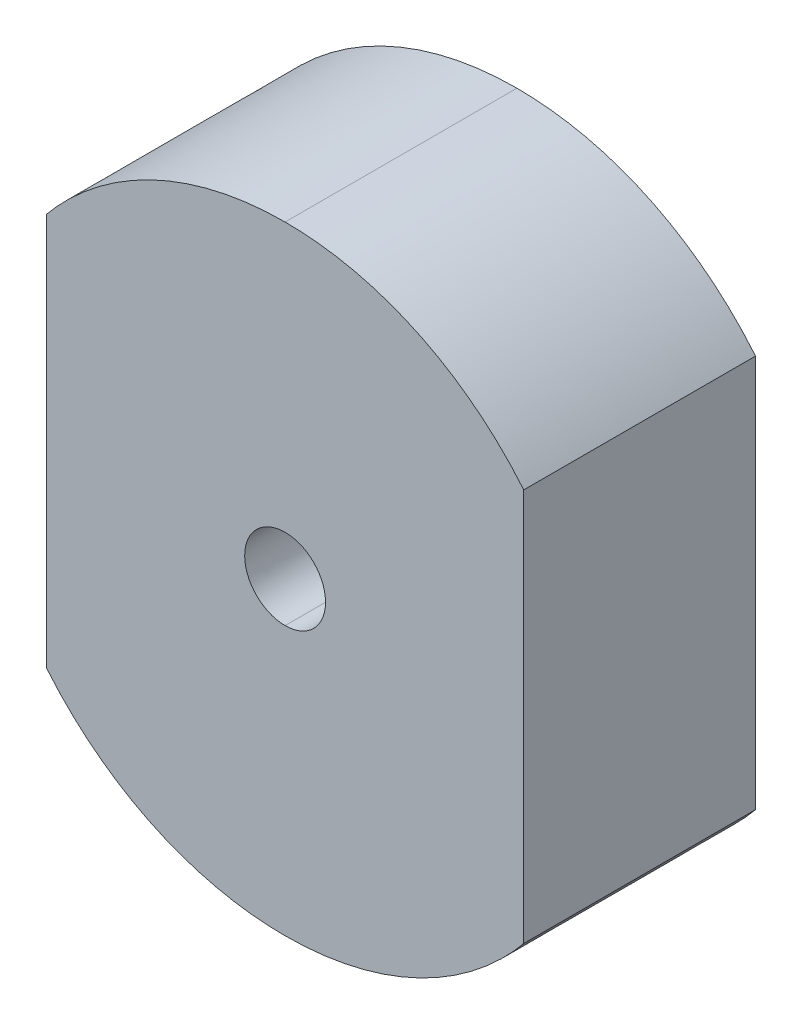
ISO-10303-21;
HEADER;
FILE_DESCRIPTION(('STEP AP214'),'2;1');
FILE_NAME('part.step','',(''),(''),'','','');
FILE_SCHEMA(('AUTOMOTIVE_DESIGN { 1 0 10303 214 1 1 1 1 }'));
ENDSEC;
DATA;
#1=APPLICATION_CONTEXT('core data for automotive mechanical design processes');
#2=APPLICATION_PROTOCOL_DEFINITION('international standard','automotive_design',2000,#1);
#3=PRODUCT_CONTEXT('',#1,'mechanical');
#4=PRODUCT('Part','Part','',(#3));
#5=PRODUCT_RELATED_PRODUCT_CATEGORY('part','',(#4));
#6=PRODUCT_DEFINITION_FORMATION('','',#4);
#7=PRODUCT_DEFINITION_CONTEXT('part definition',#1,'design');
#8=PRODUCT_DEFINITION('design','',#6,#7);
#9=PRODUCT_DEFINITION_SHAPE('','',#8);
#10=(LENGTH_UNIT() NAMED_UNIT(*) SI_UNIT(.MILLI.,.METRE.));
#11=(NAMED_UNIT(*) PLANE_ANGLE_UNIT() SI_UNIT($,.RADIAN.));
#12=(NAMED_UNIT(*) SI_UNIT($,.STERADIAN.) SOLID_ANGLE_UNIT());
#13=UNCERTAINTY_MEASURE_WITH_UNIT(LENGTH_MEASURE(1.E-05),#10,'distance_accuracy_value','');
#14=(GEOMETRIC_REPRESENTATION_CONTEXT(3) GLOBAL_UNCERTAINTY_ASSIGNED_CONTEXT((#13)) GLOBAL_UNIT_ASSIGNED_CONTEXT((#10,
#11,#12)) REPRESENTATION_CONTEXT('',''));
#15=CARTESIAN_POINT('',(0.,0.,0.));
#16=DIRECTION('',(0.,0.,1.));
#17=DIRECTION('',(1.,0.,0.));
#18=AXIS2_PLACEMENT_3D('',#15,#16,#17);
#19=CARTESIAN_POINT('',(145.612196025778,-82.1540062715015,3.175));
#20=DIRECTION('',(0.,0.,-1.));
#21=DIRECTION('',(-1.,0.,0.));
#22=AXIS2_PLACEMENT_3D('',#19,#20,#21);
#23=PLANE('',#22);
#24=CARTESIAN_POINT('',(147.044031539421,-83.2788810858527,3.175));
#25=CARTESIAN_POINT('',(146.267593144241,-82.3366259385551,3.175));
#26=CARTESIAN_POINT('',(145.091782054831,-81.7358228176235,3.175));
#27=CARTESIAN_POINT('',(143.775411069588,-81.7358228176235,3.175));
#28=B_SPLINE_CURVE_WITH_KNOTS('',3,(#24,#25,#26,#27),.UNSPECIFIED.,.F.,.F.,(4,4),(0.,1.),.UNSPECIFIED.);
#29=CARTESIAN_POINT('',(147.044031539421,-83.2788810858527,3.175));
#30=VERTEX_POINT('',#29);
#31=CARTESIAN_POINT('',(143.775411069588,-81.7358228176235,3.175));
#32=VERTEX_POINT('',#31);
#33=EDGE_CURVE('E193',#30,#32,#28,.T.);
#34=ORIENTED_EDGE('',*,*,#33,.T.);
#35=CARTESIAN_POINT('',(143.775411069588,-81.7358228176235,3.175));
#36=CARTESIAN_POINT('',(142.45912621173,-81.7358228176235,3.175));
#37=CARTESIAN_POINT('',(141.283228994935,-82.3366690022481,3.175));
#38=CARTESIAN_POINT('',(140.506790599751,-83.2789456813937,3.175));
#39=B_SPLINE_CURVE_WITH_KNOTS('',3,(#35,#36,#37,#38),.UNSPECIFIED.,.F.,.F.,(4,4),(1.,2.),.UNSPECIFIED.);
#40=CARTESIAN_POINT('',(140.506790599751,-83.2789456813937,3.175));
#41=VERTEX_POINT('',#40);
#42=EDGE_CURVE('E226',#32,#41,#39,.T.);
#43=ORIENTED_EDGE('',*,*,#42,.T.);
#44=DIRECTION('',(0.,-1.,0.));
#45=VECTOR('',#44,1.);
#46=CARTESIAN_POINT('',(140.506790599751,-83.2789456813937,3.175));
#47=LINE('',#46,#45);
#48=CARTESIAN_POINT('',(140.506790599751,-88.6593235568277,3.175));
#49=VERTEX_POINT('',#48);
#50=EDGE_CURVE('E211',#41,#49,#47,.T.);
#51=ORIENTED_EDGE('',*,*,#50,.T.);
#52=CARTESIAN_POINT('',(140.506790599751,-88.6593235568277,3.175));
#53=CARTESIAN_POINT('',(141.283228994935,-89.6016217678188,3.175));
#54=CARTESIAN_POINT('',(142.45912621173,-90.202467952444,3.175));
#55=CARTESIAN_POINT('',(143.775411069588,-90.202467952444,3.175));
#56=B_SPLINE_CURVE_WITH_KNOTS('',3,(#52,#53,#54,#55),.UNSPECIFIED.,.F.,.F.,(4,4),(3.,4.),.UNSPECIFIED.);
#57=CARTESIAN_POINT('',(143.775411069588,-90.202467952444,3.175));
#58=VERTEX_POINT('',#57);
#59=EDGE_CURVE('E150',#49,#58,#56,.T.);
#60=ORIENTED_EDGE('',*,*,#59,.T.);
#61=CARTESIAN_POINT('',(143.775411069588,-90.202467952444,3.175));
#62=CARTESIAN_POINT('',(145.091782054831,-90.202467952444,3.175));
#63=CARTESIAN_POINT('',(146.267593144241,-89.6016432996662,3.175));
#64=CARTESIAN_POINT('',(147.044031539421,-88.6593881523674,3.175));
#65=B_SPLINE_CURVE_WITH_KNOTS('',3,(#61,#62,#63,#64),.UNSPECIFIED.,.F.,.F.,(4,4),(4.,5.),.UNSPECIFIED.);
#66=CARTESIAN_POINT('',(147.044031539421,-88.6593881523674,3.175));
#67=VERTEX_POINT('',#66);
#68=EDGE_CURVE('E144',#58,#67,#65,.T.);
#69=ORIENTED_EDGE('',*,*,#68,.T.);
#70=DIRECTION('',(0.,1.,0.));
#71=VECTOR('',#70,1.);
#72=CARTESIAN_POINT('',(147.044031539421,-88.6593881523674,3.175));
#73=LINE('',#72,#71);
#74=EDGE_CURVE('E149',#67,#30,#73,.T.);
#75=ORIENTED_EDGE('',*,*,#74,.T.);
#76=EDGE_LOOP('',(#34,#43,#51,#60,#69,#75));
#77=FACE_BOUND('',#76,.T.);
#78=CARTESIAN_POINT('',(143.775411069588,-85.4155293063388,3.175));
#79=CARTESIAN_POINT('',(143.469658845195,-85.4155293063388,3.175));
#80=CARTESIAN_POINT('',(143.22178422497,-85.6633823947183,3.175));
#81=CARTESIAN_POINT('',(143.22178422497,-85.9691346191106,3.175));
#82=CARTESIAN_POINT('',(143.22178422497,-86.2749083753492,3.175));
#83=CARTESIAN_POINT('',(143.469658845195,-86.5227614637287,3.175));
#84=CARTESIAN_POINT('',(143.775411069588,-86.5227614637287,3.175));
#85=B_SPLINE_CURVE_WITH_KNOTS('',3,(#78,#79,#80,#81,#82,#83,#84),.UNSPECIFIED.,.F.,.F.,(4,3,4),
(0.,1.,2.),.UNSPECIFIED.);
#86=CARTESIAN_POINT('',(143.775411069588,-85.4155293063388,3.175));
#87=VERTEX_POINT('',#86);
#88=CARTESIAN_POINT('',(143.775411069588,-86.5227614637287,3.175));
#89=VERTEX_POINT('',#88);
#90=EDGE_CURVE('E104',#87,#89,#85,.T.);
#91=ORIENTED_EDGE('',*,*,#90,.F.);
#92=CARTESIAN_POINT('',(143.775411069588,-86.5227614637287,3.175));
#93=CARTESIAN_POINT('',(144.08116329398,-86.5227614637287,3.175));
#94=CARTESIAN_POINT('',(144.329037914206,-86.2749083753492,3.175));
#95=CARTESIAN_POINT('',(144.329037914206,-85.9691346191106,3.175));
#96=CARTESIAN_POINT('',(144.329037914206,-85.6633823947183,3.175));
#97=CARTESIAN_POINT('',(144.08116329398,-85.4155293063388,3.175));
#98=CARTESIAN_POINT('',(143.775411069588,-85.4155293063388,3.175));
#99=B_SPLINE_CURVE_WITH_KNOTS('',3,(#92,#93,#94,#95,#96,#97,#98),.UNSPECIFIED.,.F.,.F.,(4,3,4),
(2.,3.,4.),.UNSPECIFIED.);
#100=EDGE_CURVE('E98',#89,#87,#99,.T.);
#101=ORIENTED_EDGE('',*,*,#100,.F.);
#102=EDGE_LOOP('',(#91,#101));
#103=FACE_BOUND('',#102,.T.);
#104=ADVANCED_FACE('F33',(#77,#103),#23,.F.);
#105=CARTESIAN_POINT('',(145.612196025778,-82.1540062715015,0.));
#106=DIRECTION('',(0.,0.,-1.));
#107=DIRECTION('',(-1.,0.,0.));
#108=AXIS2_PLACEMENT_3D('',#105,#106,#107);
#109=PLANE('',#108);
#110=CARTESIAN_POINT('',(147.044031539421,-83.2788810858527,0.));
#111=CARTESIAN_POINT('',(146.267593144241,-82.3366259385551,0.));
#112=CARTESIAN_POINT('',(145.091782054831,-81.7358228176235,0.));
#113=CARTESIAN_POINT('',(143.775411069588,-81.7358228176235,0.));
#114=B_SPLINE_CURVE_WITH_KNOTS('',3,(#110,#111,#112,#113),.UNSPECIFIED.,.F.,.F.,(4,4),(0.,1.),.UNSPECIFIED.);
#115=CARTESIAN_POINT('',(147.044031539421,-83.2788810858527,0.));
#116=VERTEX_POINT('',#115);
#117=CARTESIAN_POINT('',(143.775411069588,-81.7358228176235,0.));
#118=VERTEX_POINT('',#117);
#119=EDGE_CURVE('E160',#116,#118,#114,.T.);
#120=ORIENTED_EDGE('',*,*,#119,.F.);
#121=DIRECTION('',(0.,1.,0.));
#122=VECTOR('',#121,1.);
#123=CARTESIAN_POINT('',(147.044031539421,-88.6593881523674,0.));
#124=LINE('',#123,#122);
#125=CARTESIAN_POINT('',(147.044031539421,-88.6593881523674,0.));
#126=VERTEX_POINT('',#125);
#127=EDGE_CURVE('E188',#126,#116,#124,.T.);
#128=ORIENTED_EDGE('',*,*,#127,.F.);
#129=CARTESIAN_POINT('',(143.775411069588,-90.202467952444,0.));
#130=CARTESIAN_POINT('',(145.091782054831,-90.202467952444,0.));
#131=CARTESIAN_POINT('',(146.267593144241,-89.6016432996662,0.));
#132=CARTESIAN_POINT('',(147.044031539421,-88.6593881523674,0.));
#133=B_SPLINE_CURVE_WITH_KNOTS('',3,(#129,#130,#131,#132),.UNSPECIFIED.,.F.,.F.,(4,4),(4.,5.),.UNSPECIFIED.);
#134=CARTESIAN_POINT('',(143.775411069588,-90.202467952444,0.));
#135=VERTEX_POINT('',#134);
#136=EDGE_CURVE('E181',#135,#126,#133,.T.);
#137=ORIENTED_EDGE('',*,*,#136,.F.);
#138=CARTESIAN_POINT('',(140.506790599751,-88.6593235568277,0.));
#139=CARTESIAN_POINT('',(141.283228994935,-89.6016217678188,0.));
#140=CARTESIAN_POINT('',(142.45912621173,-90.202467952444,0.));
#141=CARTESIAN_POINT('',(143.775411069588,-90.202467952444,0.));
#142=B_SPLINE_CURVE_WITH_KNOTS('',3,(#138,#139,#140,#141),.UNSPECIFIED.,.F.,.F.,(4,4),(3.,4.),.UNSPECIFIED.);
#143=CARTESIAN_POINT('',(140.506790599751,-88.6593235568277,0.));
#144=VERTEX_POINT('',#143);
#145=EDGE_CURVE('E177',#144,#135,#142,.T.);
#146=ORIENTED_EDGE('',*,*,#145,.F.);
#147=DIRECTION('',(0.,-1.,0.));
#148=VECTOR('',#147,1.);
#149=CARTESIAN_POINT('',(140.506790599751,-83.2789456813937,0.));
#150=LINE('',#149,#148);
#151=CARTESIAN_POINT('',(140.506790599751,-83.2789456813937,0.));
#152=VERTEX_POINT('',#151);
#153=EDGE_CURVE('E172',#152,#144,#150,.T.);
#154=ORIENTED_EDGE('',*,*,#153,.F.);
#155=CARTESIAN_POINT('',(143.775411069588,-81.7358228176235,0.));
#156=CARTESIAN_POINT('',(142.45912621173,-81.7358228176235,0.));
#157=CARTESIAN_POINT('',(141.283228994935,-82.3366690022481,0.));
#158=CARTESIAN_POINT('',(140.506790599751,-83.2789456813937,0.));
#159=B_SPLINE_CURVE_WITH_KNOTS('',3,(#155,#156,#157,#158),.UNSPECIFIED.,.F.,.F.,(4,4),(1.,2.),.UNSPECIFIED.);
#160=EDGE_CURVE('E165',#118,#152,#159,.T.);
#161=ORIENTED_EDGE('',*,*,#160,.F.);
#162=EDGE_LOOP('',(#120,#128,#137,#146,#154,#161));
#163=FACE_BOUND('',#162,.T.);
#164=CARTESIAN_POINT('',(143.775411069588,-86.5227614637287,0.));
#165=CARTESIAN_POINT('',(144.08116329398,-86.5227614637287,0.));
#166=CARTESIAN_POINT('',(144.329037914206,-86.2749083753492,0.));
#167=CARTESIAN_POINT('',(144.329037914206,-85.9691346191106,0.));
#168=CARTESIAN_POINT('',(144.329037914206,-85.6633823947183,0.));
#169=CARTESIAN_POINT('',(144.08116329398,-85.4155293063388,0.));
#170=CARTESIAN_POINT('',(143.775411069588,-85.4155293063388,0.));
#171=B_SPLINE_CURVE_WITH_KNOTS('',3,(#164,#165,#166,#167,#168,#169,#170),.UNSPECIFIED.,.F.,.F.,
(4,3,4),(2.,3.,4.),.UNSPECIFIED.);
#172=CARTESIAN_POINT('',(143.775411069588,-86.5227614637287,0.));
#173=VERTEX_POINT('',#172);
#174=CARTESIAN_POINT('',(143.775411069588,-85.4155293063388,0.));
#175=VERTEX_POINT('',#174);
#176=EDGE_CURVE('E108',#173,#175,#171,.T.);
#177=ORIENTED_EDGE('',*,*,#176,.T.);
#178=CARTESIAN_POINT('',(143.775411069588,-85.4155293063388,0.));
#179=CARTESIAN_POINT('',(143.469658845195,-85.4155293063388,0.));
#180=CARTESIAN_POINT('',(143.22178422497,-85.6633823947183,0.));
#181=CARTESIAN_POINT('',(143.22178422497,-85.9691346191106,0.));
#182=CARTESIAN_POINT('',(143.22178422497,-86.2749083753492,0.));
#183=CARTESIAN_POINT('',(143.469658845195,-86.5227614637287,0.));
#184=CARTESIAN_POINT('',(143.775411069588,-86.5227614637287,0.));
#185=B_SPLINE_CURVE_WITH_KNOTS('',3,(#178,#179,#180,#181,#182,#183,#184),.UNSPECIFIED.,.F.,.F.,
(4,3,4),(0.,1.,2.),.UNSPECIFIED.);
#186=EDGE_CURVE('E56',#175,#173,#185,.T.);
#187=ORIENTED_EDGE('',*,*,#186,.T.);
#188=EDGE_LOOP('',(#177,#187));
#189=FACE_BOUND('',#188,.T.);
#190=ADVANCED_FACE('F128',(#163,#189),#109,.T.);
#191=DIRECTION('',(0.,0.,-1.));
#192=VECTOR('',#191,1.);
#193=SURFACE_OF_LINEAR_EXTRUSION('',#28,#192);
#194=ORIENTED_EDGE('',*,*,#119,.T.);
#195=DIRECTION('',(0.,0.,-1.));
#196=VECTOR('',#195,1.);
#197=CARTESIAN_POINT('',(143.775411069588,-81.7358228176235,3.175));
#198=LINE('',#197,#196);
#199=EDGE_CURVE('E11',#32,#118,#198,.T.);
#200=ORIENTED_EDGE('',*,*,#199,.F.);
#201=ORIENTED_EDGE('',*,*,#33,.F.);
#202=DIRECTION('',(0.,0.,-1.));
#203=VECTOR('',#202,1.);
#204=CARTESIAN_POINT('',(147.044031539421,-83.2788810858527,3.175));
#205=LINE('',#204,#203);
#206=EDGE_CURVE('E159',#30,#116,#205,.T.);
#207=ORIENTED_EDGE('',*,*,#206,.T.);
#208=EDGE_LOOP('',(#194,#200,#201,#207));
#209=FACE_BOUND('',#208,.T.);
#210=ADVANCED_FACE('F35',(#209),#193,.F.);
#211=DIRECTION('',(0.,0.,-1.));
#212=VECTOR('',#211,1.);
#213=SURFACE_OF_LINEAR_EXTRUSION('',#39,#212);
#214=ORIENTED_EDGE('',*,*,#160,.T.);
#215=DIRECTION('',(0.,0.,-1.));
#216=VECTOR('',#215,1.);
#217=CARTESIAN_POINT('',(140.506790599751,-83.2789456813937,3.175));
#218=LINE('',#217,#216);
#219=EDGE_CURVE('E42',#41,#152,#218,.T.);
#220=ORIENTED_EDGE('',*,*,#219,.F.);
#221=ORIENTED_EDGE('',*,*,#42,.F.);
#222=ORIENTED_EDGE('',*,*,#199,.T.);
#223=EDGE_LOOP('',(#214,#220,#221,#222));
#224=FACE_BOUND('',#223,.T.);
#225=ADVANCED_FACE('F238',(#224),#213,.F.);
#226=CARTESIAN_POINT('',(140.506790599751,-83.2789456813937,3.175));
#227=DIRECTION('',(1.,0.,0.));
#228=DIRECTION('',(0.,0.,-1.));
#229=AXIS2_PLACEMENT_3D('',#226,#227,#228);
#230=PLANE('',#229);
#231=ORIENTED_EDGE('',*,*,#153,.T.);
#232=DIRECTION('',(0.,0.,-1.));
#233=VECTOR('',#232,1.);
#234=CARTESIAN_POINT('',(140.506790599751,-88.6593235568277,3.175));
#235=LINE('',#234,#233);
#236=EDGE_CURVE('E202',#49,#144,#235,.T.);
#237=ORIENTED_EDGE('',*,*,#236,.F.);
#238=ORIENTED_EDGE('',*,*,#50,.F.);
#239=ORIENTED_EDGE('',*,*,#219,.T.);
#240=EDGE_LOOP('',(#231,#237,#238,#239));
#241=FACE_BOUND('',#240,.T.);
#242=ADVANCED_FACE('F209',(#241),#230,.F.);
#243=DIRECTION('',(0.,0.,-1.));
#244=VECTOR('',#243,1.);
#245=SURFACE_OF_LINEAR_EXTRUSION('',#56,#244);
#246=ORIENTED_EDGE('',*,*,#145,.T.);
#247=DIRECTION('',(0.,0.,-1.));
#248=VECTOR('',#247,1.);
#249=CARTESIAN_POINT('',(143.775411069588,-90.202467952444,3.175));
#250=LINE('',#249,#248);
#251=EDGE_CURVE('E199',#58,#135,#250,.T.);
#252=ORIENTED_EDGE('',*,*,#251,.F.);
#253=ORIENTED_EDGE('',*,*,#59,.F.);
#254=ORIENTED_EDGE('',*,*,#236,.T.);
#255=EDGE_LOOP('',(#246,#252,#253,#254));
#256=FACE_BOUND('',#255,.T.);
#257=ADVANCED_FACE('F140',(#256),#245,.F.);
#258=DIRECTION('',(0.,0.,-1.));
#259=VECTOR('',#258,1.);
#260=SURFACE_OF_LINEAR_EXTRUSION('',#65,#259);
#261=ORIENTED_EDGE('',*,*,#136,.T.);
#262=DIRECTION('',(0.,0.,-1.));
#263=VECTOR('',#262,1.);
#264=CARTESIAN_POINT('',(147.044031539421,-88.6593881523674,3.175));
#265=LINE('',#264,#263);
#266=EDGE_CURVE('E196',#67,#126,#265,.T.);
#267=ORIENTED_EDGE('',*,*,#266,.F.);
#268=ORIENTED_EDGE('',*,*,#68,.F.);
#269=ORIENTED_EDGE('',*,*,#251,.T.);
#270=EDGE_LOOP('',(#261,#267,#268,#269));
#271=FACE_BOUND('',#270,.T.);
#272=ADVANCED_FACE('F135',(#271),#260,.F.);
#273=CARTESIAN_POINT('',(147.044031539421,-88.6593881523674,3.175));
#274=DIRECTION('',(-1.,0.,0.));
#275=DIRECTION('',(0.,0.,1.));
#276=AXIS2_PLACEMENT_3D('',#273,#274,#275);
#277=PLANE('',#276);
#278=ORIENTED_EDGE('',*,*,#127,.T.);
#279=ORIENTED_EDGE('',*,*,#206,.F.);
#280=ORIENTED_EDGE('',*,*,#74,.F.);
#281=ORIENTED_EDGE('',*,*,#266,.T.);
#282=EDGE_LOOP('',(#278,#279,#280,#281));
#283=FACE_BOUND('',#282,.T.);
#284=ADVANCED_FACE('F125',(#283),#277,.F.);
#285=DIRECTION('',(0.,0.,-1.));
#286=VECTOR('',#285,1.);
#287=SURFACE_OF_LINEAR_EXTRUSION('',#85,#286);
#288=ORIENTED_EDGE('',*,*,#186,.F.);
#289=DIRECTION('',(0.,0.,-1.));
#290=VECTOR('',#289,1.);
#291=CARTESIAN_POINT('',(143.775411069588,-85.4155293063388,3.175));
#292=LINE('',#291,#290);
#293=EDGE_CURVE('E100',#87,#175,#292,.T.);
#294=ORIENTED_EDGE('',*,*,#293,.F.);
#295=ORIENTED_EDGE('',*,*,#90,.T.);
#296=DIRECTION('',(0.,0.,-1.));
#297=VECTOR('',#296,1.);
#298=CARTESIAN_POINT('',(143.775411069588,-86.5227614637287,3.175));
#299=LINE('',#298,#297);
#300=EDGE_CURVE('E49',#89,#173,#299,.T.);
#301=ORIENTED_EDGE('',*,*,#300,.T.);
#302=EDGE_LOOP('',(#288,#294,#295,#301));
#303=FACE_BOUND('',#302,.T.);
#304=ADVANCED_FACE('F106',(#303),#287,.T.);
#305=DIRECTION('',(0.,0.,-1.));
#306=VECTOR('',#305,1.);
#307=SURFACE_OF_LINEAR_EXTRUSION('',#99,#306);
#308=ORIENTED_EDGE('',*,*,#176,.F.);
#309=ORIENTED_EDGE('',*,*,#300,.F.);
#310=ORIENTED_EDGE('',*,*,#100,.T.);
#311=ORIENTED_EDGE('',*,*,#293,.T.);
#312=EDGE_LOOP('',(#308,#309,#310,#311));
#313=FACE_BOUND('',#312,.T.);
#314=ADVANCED_FACE('F99',(#313),#307,.T.);
#315=CLOSED_SHELL('',(#104,#190,#210,#225,#242,#257,#272,#284,#304,#314));
#316=MANIFOLD_SOLID_BREP('B2',#315);
#317=ADVANCED_BREP_SHAPE_REPRESENTATION('',(#18,#316),#14);
#318=SHAPE_DEFINITION_REPRESENTATION(#9,#317);
ENDSEC;
END-ISO-10303-21;
